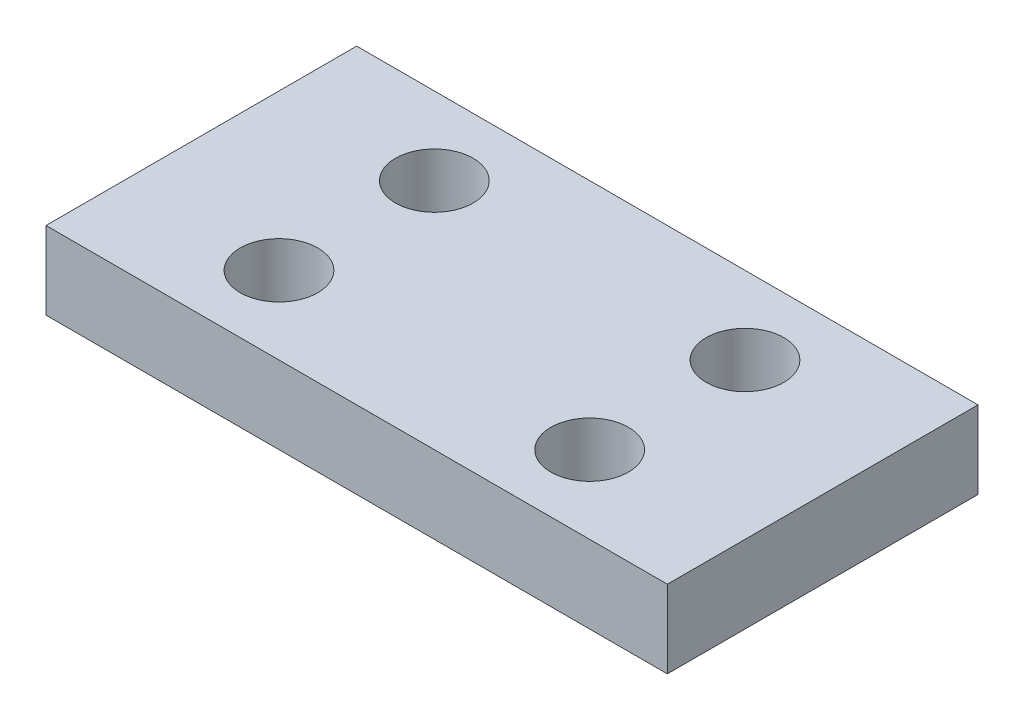
ISO-10303-21;
HEADER;
FILE_DESCRIPTION(('STEP AP214'),'2;1');
FILE_NAME('part.step','',(''),(''),'','','');
FILE_SCHEMA(('AUTOMOTIVE_DESIGN { 1 0 10303 214 1 1 1 1 }'));
ENDSEC;
DATA;
#1=APPLICATION_CONTEXT('core data for automotive mechanical design processes');
#2=APPLICATION_PROTOCOL_DEFINITION('international standard','automotive_design',2000,#1);
#3=PRODUCT_CONTEXT('',#1,'mechanical');
#4=PRODUCT('Part','Part','',(#3));
#5=PRODUCT_RELATED_PRODUCT_CATEGORY('part','',(#4));
#6=PRODUCT_DEFINITION_FORMATION('','',#4);
#7=PRODUCT_DEFINITION_CONTEXT('part definition',#1,'design');
#8=PRODUCT_DEFINITION('design','',#6,#7);
#9=PRODUCT_DEFINITION_SHAPE('','',#8);
#10=(LENGTH_UNIT() NAMED_UNIT(*) SI_UNIT(.MILLI.,.METRE.));
#11=(NAMED_UNIT(*) PLANE_ANGLE_UNIT() SI_UNIT($,.RADIAN.));
#12=(NAMED_UNIT(*) SI_UNIT($,.STERADIAN.) SOLID_ANGLE_UNIT());
#13=UNCERTAINTY_MEASURE_WITH_UNIT(LENGTH_MEASURE(1.E-05),#10,'distance_accuracy_value','');
#14=(GEOMETRIC_REPRESENTATION_CONTEXT(3) GLOBAL_UNCERTAINTY_ASSIGNED_CONTEXT((#13)) GLOBAL_UNIT_ASSIGNED_CONTEXT((#10,
#11,#12)) REPRESENTATION_CONTEXT('',''));
#15=CARTESIAN_POINT('',(0.,0.,0.));
#16=DIRECTION('',(0.,0.,1.));
#17=DIRECTION('',(1.,0.,0.));
#18=AXIS2_PLACEMENT_3D('',#15,#16,#17);
#19=CARTESIAN_POINT('',(0.,3.175,0.));
#20=DIRECTION('',(0.,-1.,0.));
#21=DIRECTION('',(0.,0.,-1.));
#22=AXIS2_PLACEMENT_3D('',#19,#20,#21);
#23=PLANE('',#22);
#24=DIRECTION('',(0.,0.,-1.));
#25=VECTOR('',#24,1.);
#26=CARTESIAN_POINT('',(12.7,3.175,6.35));
#27=LINE('',#26,#25);
#28=CARTESIAN_POINT('',(12.7,3.175,6.35));
#29=VERTEX_POINT('',#28);
#30=CARTESIAN_POINT('',(12.7,3.175,-6.35));
#31=VERTEX_POINT('',#30);
#32=EDGE_CURVE('E85',#29,#31,#27,.T.);
#33=ORIENTED_EDGE('',*,*,#32,.T.);
#34=DIRECTION('',(-1.,0.,0.));
#35=VECTOR('',#34,1.);
#36=CARTESIAN_POINT('',(-12.7,3.175,-6.35));
#37=LINE('',#36,#35);
#38=CARTESIAN_POINT('',(-12.7,3.175,-6.35));
#39=VERTEX_POINT('',#38);
#40=EDGE_CURVE('E80',#31,#39,#37,.T.);
#41=ORIENTED_EDGE('',*,*,#40,.T.);
#42=DIRECTION('',(0.,0.,1.));
#43=VECTOR('',#42,1.);
#44=CARTESIAN_POINT('',(-12.7,3.175,6.35));
#45=LINE('',#44,#43);
#46=CARTESIAN_POINT('',(-12.7,3.175,6.35));
#47=VERTEX_POINT('',#46);
#48=EDGE_CURVE('E83',#39,#47,#45,.T.);
#49=ORIENTED_EDGE('',*,*,#48,.T.);
#50=DIRECTION('',(1.,0.,0.));
#51=VECTOR('',#50,1.);
#52=CARTESIAN_POINT('',(-12.7,3.175,6.35));
#53=LINE('',#52,#51);
#54=EDGE_CURVE('E50',#47,#29,#53,.T.);
#55=ORIENTED_EDGE('',*,*,#54,.T.);
#56=EDGE_LOOP('',(#33,#41,#49,#55));
#57=FACE_BOUND('',#56,.T.);
#58=CARTESIAN_POINT('',(6.35,3.175,-3.175));
#59=DIRECTION('',(0.,1.,0.));
#60=DIRECTION('',(0.,0.,1.));
#61=AXIS2_PLACEMENT_3D('',#58,#59,#60);
#62=CIRCLE('',#61,1.5875);
#63=CARTESIAN_POINT('',(6.35,3.175,-1.5875));
#64=VERTEX_POINT('',#63);
#65=EDGE_CURVE('E100',#64,#64,#62,.T.);
#66=ORIENTED_EDGE('',*,*,#65,.F.);
#67=EDGE_LOOP('',(#66));
#68=FACE_BOUND('',#67,.T.);
#69=CARTESIAN_POINT('',(-6.35,3.175,-3.175));
#70=DIRECTION('',(0.,1.,0.));
#71=DIRECTION('',(0.,0.,-1.));
#72=AXIS2_PLACEMENT_3D('',#69,#70,#71);
#73=CIRCLE('',#72,1.5875);
#74=CARTESIAN_POINT('',(-6.35,3.175,-4.7625));
#75=VERTEX_POINT('',#74);
#76=EDGE_CURVE('E115',#75,#75,#73,.T.);
#77=ORIENTED_EDGE('',*,*,#76,.F.);
#78=EDGE_LOOP('',(#77));
#79=FACE_BOUND('',#78,.T.);
#80=CARTESIAN_POINT('',(-6.35,3.175,3.175));
#81=DIRECTION('',(0.,1.,0.));
#82=DIRECTION('',(0.,0.,1.));
#83=AXIS2_PLACEMENT_3D('',#80,#81,#82);
#84=CIRCLE('',#83,1.5875);
#85=CARTESIAN_POINT('',(-6.35,3.175,4.76249999999999));
#86=VERTEX_POINT('',#85);
#87=EDGE_CURVE('E121',#86,#86,#84,.T.);
#88=ORIENTED_EDGE('',*,*,#87,.F.);
#89=EDGE_LOOP('',(#88));
#90=FACE_BOUND('',#89,.T.);
#91=CARTESIAN_POINT('',(6.35,3.175,3.175));
#92=DIRECTION('',(0.,1.,0.));
#93=DIRECTION('',(0.,0.,-1.));
#94=AXIS2_PLACEMENT_3D('',#91,#92,#93);
#95=CIRCLE('',#94,1.5875);
#96=CARTESIAN_POINT('',(6.35,3.175,1.5875));
#97=VERTEX_POINT('',#96);
#98=EDGE_CURVE('E127',#97,#97,#95,.T.);
#99=ORIENTED_EDGE('',*,*,#98,.F.);
#100=EDGE_LOOP('',(#99));
#101=FACE_BOUND('',#100,.T.);
#102=ADVANCED_FACE('F33',(#57,#68,#79,#90,#101),#23,.F.);
#103=CARTESIAN_POINT('',(0.,0.,0.));
#104=DIRECTION('',(0.,-1.,0.));
#105=DIRECTION('',(0.,0.,-1.));
#106=AXIS2_PLACEMENT_3D('',#103,#104,#105);
#107=PLANE('',#106);
#108=CARTESIAN_POINT('',(-6.35,0.,3.175));
#109=DIRECTION('',(0.,1.,0.));
#110=DIRECTION('',(0.,0.,1.));
#111=AXIS2_PLACEMENT_3D('',#108,#109,#110);
#112=CIRCLE('',#111,1.5875);
#113=CARTESIAN_POINT('',(-6.35,0.,4.76249999999999));
#114=VERTEX_POINT('',#113);
#115=EDGE_CURVE('E124',#114,#114,#112,.T.);
#116=ORIENTED_EDGE('',*,*,#115,.T.);
#117=EDGE_LOOP('',(#116));
#118=FACE_BOUND('',#117,.T.);
#119=CARTESIAN_POINT('',(6.35,0.,-3.175));
#120=DIRECTION('',(0.,1.,0.));
#121=DIRECTION('',(0.,0.,1.));
#122=AXIS2_PLACEMENT_3D('',#119,#120,#121);
#123=CIRCLE('',#122,1.5875);
#124=CARTESIAN_POINT('',(6.35,0.,-1.5875));
#125=VERTEX_POINT('',#124);
#126=EDGE_CURVE('E112',#125,#125,#123,.T.);
#127=ORIENTED_EDGE('',*,*,#126,.T.);
#128=EDGE_LOOP('',(#127));
#129=FACE_BOUND('',#128,.T.);
#130=DIRECTION('',(0.,0.,-1.));
#131=VECTOR('',#130,1.);
#132=CARTESIAN_POINT('',(12.7,0.,6.35));
#133=LINE('',#132,#131);
#134=CARTESIAN_POINT('',(12.7,0.,6.35));
#135=VERTEX_POINT('',#134);
#136=CARTESIAN_POINT('',(12.7,0.,-6.35));
#137=VERTEX_POINT('',#136);
#138=EDGE_CURVE('E97',#135,#137,#133,.T.);
#139=ORIENTED_EDGE('',*,*,#138,.F.);
#140=DIRECTION('',(1.,0.,0.));
#141=VECTOR('',#140,1.);
#142=CARTESIAN_POINT('',(-12.7,0.,6.35));
#143=LINE('',#142,#141);
#144=CARTESIAN_POINT('',(-12.7,0.,6.35));
#145=VERTEX_POINT('',#144);
#146=EDGE_CURVE('E73',#145,#135,#143,.T.);
#147=ORIENTED_EDGE('',*,*,#146,.F.);
#148=DIRECTION('',(0.,0.,1.));
#149=VECTOR('',#148,1.);
#150=CARTESIAN_POINT('',(-12.7,0.,6.35));
#151=LINE('',#150,#149);
#152=CARTESIAN_POINT('',(-12.7,0.,-6.35));
#153=VERTEX_POINT('',#152);
#154=EDGE_CURVE('E67',#153,#145,#151,.T.);
#155=ORIENTED_EDGE('',*,*,#154,.F.);
#156=DIRECTION('',(-1.,0.,0.));
#157=VECTOR('',#156,1.);
#158=CARTESIAN_POINT('',(-12.7,0.,-6.35));
#159=LINE('',#158,#157);
#160=EDGE_CURVE('E89',#137,#153,#159,.T.);
#161=ORIENTED_EDGE('',*,*,#160,.F.);
#162=EDGE_LOOP('',(#139,#147,#155,#161));
#163=FACE_BOUND('',#162,.T.);
#164=CARTESIAN_POINT('',(-6.35,0.,-3.175));
#165=DIRECTION('',(0.,1.,0.));
#166=DIRECTION('',(0.,0.,-1.));
#167=AXIS2_PLACEMENT_3D('',#164,#165,#166);
#168=CIRCLE('',#167,1.5875);
#169=CARTESIAN_POINT('',(-6.35,0.,-4.7625));
#170=VERTEX_POINT('',#169);
#171=EDGE_CURVE('E118',#170,#170,#168,.T.);
#172=ORIENTED_EDGE('',*,*,#171,.T.);
#173=EDGE_LOOP('',(#172));
#174=FACE_BOUND('',#173,.T.);
#175=CARTESIAN_POINT('',(6.35,0.,3.175));
#176=DIRECTION('',(0.,1.,0.));
#177=DIRECTION('',(0.,0.,-1.));
#178=AXIS2_PLACEMENT_3D('',#175,#176,#177);
#179=CIRCLE('',#178,1.5875);
#180=CARTESIAN_POINT('',(6.35,0.,1.5875));
#181=VERTEX_POINT('',#180);
#182=EDGE_CURVE('E130',#181,#181,#179,.T.);
#183=ORIENTED_EDGE('',*,*,#182,.T.);
#184=EDGE_LOOP('',(#183));
#185=FACE_BOUND('',#184,.T.);
#186=ADVANCED_FACE('F108',(#118,#129,#163,#174,#185),#107,.T.);
#187=CARTESIAN_POINT('',(12.7,3.175,6.35));
#188=DIRECTION('',(-1.,0.,0.));
#189=DIRECTION('',(0.,0.,1.));
#190=AXIS2_PLACEMENT_3D('',#187,#188,#189);
#191=PLANE('',#190);
#192=ORIENTED_EDGE('',*,*,#138,.T.);
#193=DIRECTION('',(0.,-1.,0.));
#194=VECTOR('',#193,1.);
#195=CARTESIAN_POINT('',(12.7,3.175,-6.35));
#196=LINE('',#195,#194);
#197=EDGE_CURVE('E11',#31,#137,#196,.T.);
#198=ORIENTED_EDGE('',*,*,#197,.F.);
#199=ORIENTED_EDGE('',*,*,#32,.F.);
#200=DIRECTION('',(0.,-1.,0.));
#201=VECTOR('',#200,1.);
#202=CARTESIAN_POINT('',(12.7,3.175,6.35));
#203=LINE('',#202,#201);
#204=EDGE_CURVE('E93',#29,#135,#203,.T.);
#205=ORIENTED_EDGE('',*,*,#204,.T.);
#206=EDGE_LOOP('',(#192,#198,#199,#205));
#207=FACE_BOUND('',#206,.T.);
#208=ADVANCED_FACE('F35',(#207),#191,.F.);
#209=CARTESIAN_POINT('',(-12.7,3.175,-6.35));
#210=DIRECTION('',(0.,0.,1.));
#211=DIRECTION('',(1.,0.,0.));
#212=AXIS2_PLACEMENT_3D('',#209,#210,#211);
#213=PLANE('',#212);
#214=ORIENTED_EDGE('',*,*,#160,.T.);
#215=DIRECTION('',(0.,-1.,0.));
#216=VECTOR('',#215,1.);
#217=CARTESIAN_POINT('',(-12.7,3.175,-6.35));
#218=LINE('',#217,#216);
#219=EDGE_CURVE('E42',#39,#153,#218,.T.);
#220=ORIENTED_EDGE('',*,*,#219,.F.);
#221=ORIENTED_EDGE('',*,*,#40,.F.);
#222=ORIENTED_EDGE('',*,*,#197,.T.);
#223=EDGE_LOOP('',(#214,#220,#221,#222));
#224=FACE_BOUND('',#223,.T.);
#225=ADVANCED_FACE('F88',(#224),#213,.F.);
#226=CARTESIAN_POINT('',(-12.7,3.175,6.35));
#227=DIRECTION('',(1.,0.,0.));
#228=DIRECTION('',(0.,0.,-1.));
#229=AXIS2_PLACEMENT_3D('',#226,#227,#228);
#230=PLANE('',#229);
#231=ORIENTED_EDGE('',*,*,#154,.T.);
#232=DIRECTION('',(0.,-1.,0.));
#233=VECTOR('',#232,1.);
#234=CARTESIAN_POINT('',(-12.7,3.175,6.35));
#235=LINE('',#234,#233);
#236=EDGE_CURVE('E90',#47,#145,#235,.T.);
#237=ORIENTED_EDGE('',*,*,#236,.F.);
#238=ORIENTED_EDGE('',*,*,#48,.F.);
#239=ORIENTED_EDGE('',*,*,#219,.T.);
#240=EDGE_LOOP('',(#231,#237,#238,#239));
#241=FACE_BOUND('',#240,.T.);
#242=ADVANCED_FACE('F91',(#241),#230,.F.);
#243=CARTESIAN_POINT('',(-12.7,3.175,6.35));
#244=DIRECTION('',(0.,0.,-1.));
#245=DIRECTION('',(-1.,0.,0.));
#246=AXIS2_PLACEMENT_3D('',#243,#244,#245);
#247=PLANE('',#246);
#248=ORIENTED_EDGE('',*,*,#146,.T.);
#249=ORIENTED_EDGE('',*,*,#204,.F.);
#250=ORIENTED_EDGE('',*,*,#54,.F.);
#251=ORIENTED_EDGE('',*,*,#236,.T.);
#252=EDGE_LOOP('',(#248,#249,#250,#251));
#253=FACE_BOUND('',#252,.T.);
#254=ADVANCED_FACE('F105',(#253),#247,.F.);
#255=CARTESIAN_POINT('',(6.35,3.175,-3.175));
#256=DIRECTION('',(0.,-1.,0.));
#257=DIRECTION('',(0.,0.,-1.));
#258=AXIS2_PLACEMENT_3D('',#255,#256,#257);
#259=CYLINDRICAL_SURFACE('',#258,1.5875);
#260=ORIENTED_EDGE('',*,*,#65,.T.);
#261=EDGE_LOOP('',(#260));
#262=FACE_BOUND('',#261,.T.);
#263=ORIENTED_EDGE('',*,*,#126,.F.);
#264=EDGE_LOOP('',(#263));
#265=FACE_BOUND('',#264,.T.);
#266=ADVANCED_FACE('F147',(#262,#265),#259,.F.);
#267=CARTESIAN_POINT('',(-6.35,3.175,-3.175));
#268=DIRECTION('',(0.,-1.,0.));
#269=DIRECTION('',(0.,0.,-1.));
#270=AXIS2_PLACEMENT_3D('',#267,#268,#269);
#271=CYLINDRICAL_SURFACE('',#270,1.5875);
#272=ORIENTED_EDGE('',*,*,#76,.T.);
#273=EDGE_LOOP('',(#272));
#274=FACE_BOUND('',#273,.T.);
#275=ORIENTED_EDGE('',*,*,#171,.F.);
#276=EDGE_LOOP('',(#275));
#277=FACE_BOUND('',#276,.T.);
#278=ADVANCED_FACE('F193',(#274,#277),#271,.F.);
#279=CARTESIAN_POINT('',(-6.35,3.175,3.175));
#280=DIRECTION('',(0.,-1.,0.));
#281=DIRECTION('',(0.,0.,-1.));
#282=AXIS2_PLACEMENT_3D('',#279,#280,#281);
#283=CYLINDRICAL_SURFACE('',#282,1.5875);
#284=ORIENTED_EDGE('',*,*,#87,.T.);
#285=EDGE_LOOP('',(#284));
#286=FACE_BOUND('',#285,.T.);
#287=ORIENTED_EDGE('',*,*,#115,.F.);
#288=EDGE_LOOP('',(#287));
#289=FACE_BOUND('',#288,.T.);
#290=ADVANCED_FACE('F201',(#286,#289),#283,.F.);
#291=CARTESIAN_POINT('',(6.35,3.175,3.175));
#292=DIRECTION('',(0.,-1.,0.));
#293=DIRECTION('',(0.,0.,-1.));
#294=AXIS2_PLACEMENT_3D('',#291,#292,#293);
#295=CYLINDRICAL_SURFACE('',#294,1.5875);
#296=ORIENTED_EDGE('',*,*,#98,.T.);
#297=EDGE_LOOP('',(#296));
#298=FACE_BOUND('',#297,.T.);
#299=ORIENTED_EDGE('',*,*,#182,.F.);
#300=EDGE_LOOP('',(#299));
#301=FACE_BOUND('',#300,.T.);
#302=ADVANCED_FACE('F136',(#298,#301),#295,.F.);
#303=CLOSED_SHELL('',(#102,#186,#208,#225,#242,#254,#266,#278,#290,#302));
#304=MANIFOLD_SOLID_BREP('B2',#303);
#305=ADVANCED_BREP_SHAPE_REPRESENTATION('',(#18,#304),#14);
#306=SHAPE_DEFINITION_REPRESENTATION(#9,#305);
ENDSEC;
END-ISO-10303-21;
